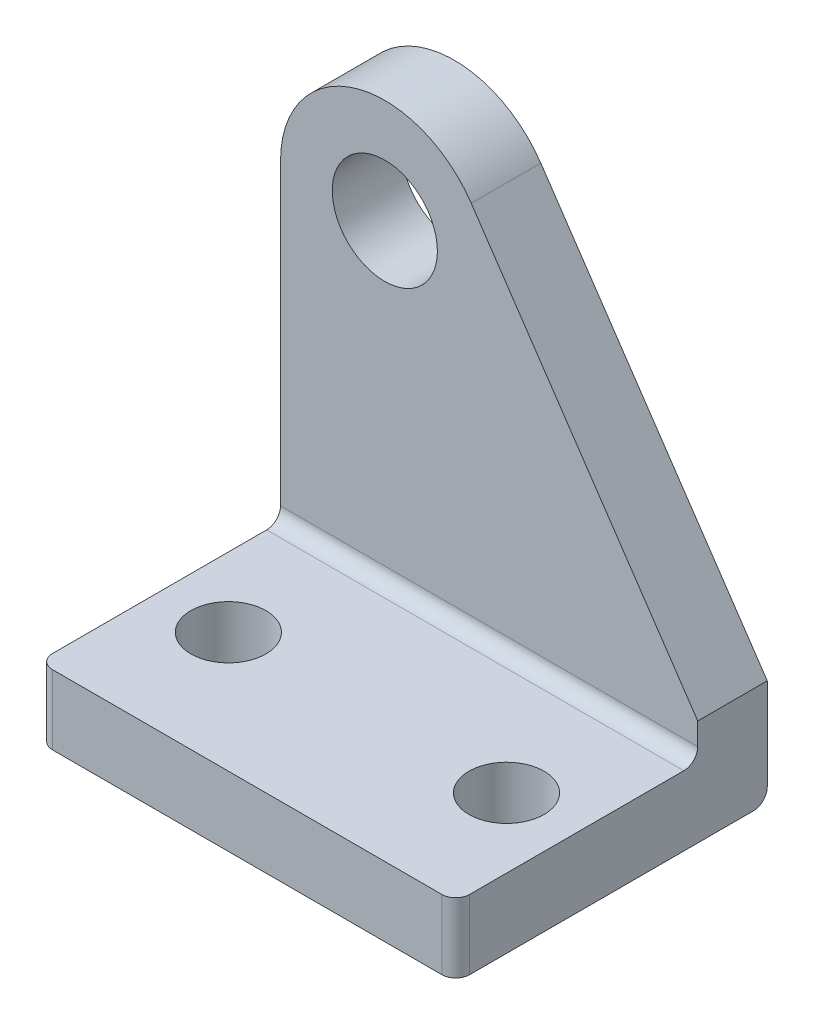
ISO-10303-21;
HEADER;
FILE_DESCRIPTION(('STEP AP214'),'2;1');
FILE_NAME('part.step','',(''),(''),'','','');
FILE_SCHEMA(('AUTOMOTIVE_DESIGN { 1 0 10303 214 1 1 1 1 }'));
ENDSEC;
DATA;
#1=APPLICATION_CONTEXT('core data for automotive mechanical design processes');
#2=APPLICATION_PROTOCOL_DEFINITION('international standard','automotive_design',2000,#1);
#3=PRODUCT_CONTEXT('',#1,'mechanical');
#4=PRODUCT('Part','Part','',(#3));
#5=PRODUCT_RELATED_PRODUCT_CATEGORY('part','',(#4));
#6=PRODUCT_DEFINITION_FORMATION('','',#4);
#7=PRODUCT_DEFINITION_CONTEXT('part definition',#1,'design');
#8=PRODUCT_DEFINITION('design','',#6,#7);
#9=PRODUCT_DEFINITION_SHAPE('','',#8);
#10=(LENGTH_UNIT() NAMED_UNIT(*) SI_UNIT(.MILLI.,.METRE.));
#11=(NAMED_UNIT(*) PLANE_ANGLE_UNIT() SI_UNIT($,.RADIAN.));
#12=(NAMED_UNIT(*) SI_UNIT($,.STERADIAN.) SOLID_ANGLE_UNIT());
#13=UNCERTAINTY_MEASURE_WITH_UNIT(LENGTH_MEASURE(1.E-05),#10,'distance_accuracy_value','');
#14=(GEOMETRIC_REPRESENTATION_CONTEXT(3) GLOBAL_UNCERTAINTY_ASSIGNED_CONTEXT((#13)) GLOBAL_UNIT_ASSIGNED_CONTEXT((#10,
#11,#12)) REPRESENTATION_CONTEXT('',''));
#15=CARTESIAN_POINT('',(0.,0.,0.));
#16=DIRECTION('',(0.,0.,1.));
#17=DIRECTION('',(1.,0.,0.));
#18=AXIS2_PLACEMENT_3D('',#15,#16,#17);
#19=CARTESIAN_POINT('',(12.6999999999998,-15.875,3.2385));
#20=DIRECTION('',(0.,1.,0.));
#21=DIRECTION('',(0.,0.,1.));
#22=AXIS2_PLACEMENT_3D('',#19,#20,#21);
#23=CYLINDRICAL_SURFACE('',#22,3.429);
#24=CARTESIAN_POINT('',(12.6999999999998,-22.225,3.2385));
#25=DIRECTION('',(0.,1.,0.));
#26=DIRECTION('',(0.,0.,1.));
#27=AXIS2_PLACEMENT_3D('',#24,#25,#26);
#28=CIRCLE('',#27,3.429);
#29=CARTESIAN_POINT('',(12.6999999999998,-22.225,6.6675));
#30=VERTEX_POINT('',#29);
#31=EDGE_CURVE('E169',#30,#30,#28,.F.);
#32=ORIENTED_EDGE('',*,*,#31,.T.);
#33=EDGE_LOOP('',(#32));
#34=FACE_BOUND('',#33,.T.);
#35=CARTESIAN_POINT('',(12.6999999999998,-15.875,3.2385));
#36=DIRECTION('',(0.,1.,0.));
#37=DIRECTION('',(0.,0.,1.));
#38=AXIS2_PLACEMENT_3D('',#35,#36,#37);
#39=CIRCLE('',#38,3.429);
#40=CARTESIAN_POINT('',(12.6999999999998,-15.875,6.6675));
#41=VERTEX_POINT('',#40);
#42=EDGE_CURVE('E19',#41,#41,#39,.T.);
#43=ORIENTED_EDGE('',*,*,#42,.T.);
#44=EDGE_LOOP('',(#43));
#45=FACE_BOUND('',#44,.T.);
#46=ADVANCED_FACE('F16',(#34,#45),#23,.F.);
#47=CARTESIAN_POINT('',(-12.7000000000002,-15.875,3.2385));
#48=DIRECTION('',(0.,1.,0.));
#49=DIRECTION('',(0.,0.,1.));
#50=AXIS2_PLACEMENT_3D('',#47,#48,#49);
#51=CYLINDRICAL_SURFACE('',#50,3.429);
#52=CARTESIAN_POINT('',(-12.7000000000002,-22.225,3.2385));
#53=DIRECTION('',(0.,1.,0.));
#54=DIRECTION('',(0.,0.,1.));
#55=AXIS2_PLACEMENT_3D('',#52,#53,#54);
#56=CIRCLE('',#55,3.429);
#57=CARTESIAN_POINT('',(-12.7000000000002,-22.225,6.6675));
#58=VERTEX_POINT('',#57);
#59=EDGE_CURVE('E166',#58,#58,#56,.F.);
#60=ORIENTED_EDGE('',*,*,#59,.T.);
#61=EDGE_LOOP('',(#60));
#62=FACE_BOUND('',#61,.T.);
#63=CARTESIAN_POINT('',(-12.7000000000002,-15.875,3.2385));
#64=DIRECTION('',(0.,1.,0.));
#65=DIRECTION('',(0.,0.,1.));
#66=AXIS2_PLACEMENT_3D('',#63,#64,#65);
#67=CIRCLE('',#66,3.429);
#68=CARTESIAN_POINT('',(-12.7000000000002,-15.875,6.6675));
#69=VERTEX_POINT('',#68);
#70=EDGE_CURVE('E172',#69,#69,#67,.T.);
#71=ORIENTED_EDGE('',*,*,#70,.T.);
#72=EDGE_LOOP('',(#71));
#73=FACE_BOUND('',#72,.T.);
#74=ADVANCED_FACE('F390',(#62,#73),#51,.F.);
#75=CARTESIAN_POINT('',(19.05,-15.875,14.224));
#76=DIRECTION('',(0.,0.,-1.));
#77=DIRECTION('',(-1.,0.,0.));
#78=AXIS2_PLACEMENT_3D('',#75,#76,#77);
#79=PLANE('',#78);
#80=DIRECTION('',(1.,0.,0.));
#81=VECTOR('',#80,1.);
#82=CARTESIAN_POINT('',(19.05,-22.225,14.224));
#83=LINE('',#82,#81);
#84=CARTESIAN_POINT('',(-17.7800000000001,-22.225,14.224));
#85=VERTEX_POINT('',#84);
#86=CARTESIAN_POINT('',(17.7799999999999,-22.225,14.224));
#87=VERTEX_POINT('',#86);
#88=EDGE_CURVE('E161',#85,#87,#83,.T.);
#89=ORIENTED_EDGE('',*,*,#88,.T.);
#90=DIRECTION('',(0.,1.,0.));
#91=VECTOR('',#90,1.);
#92=CARTESIAN_POINT('',(17.7799999999999,-15.875,14.224));
#93=LINE('',#92,#91);
#94=CARTESIAN_POINT('',(17.7799999999999,-15.875,14.224));
#95=VERTEX_POINT('',#94);
#96=EDGE_CURVE('E133',#95,#87,#93,.F.);
#97=ORIENTED_EDGE('',*,*,#96,.F.);
#98=DIRECTION('',(1.,0.,0.));
#99=VECTOR('',#98,1.);
#100=CARTESIAN_POINT('',(19.05,-15.875,14.224));
#101=LINE('',#100,#99);
#102=CARTESIAN_POINT('',(-17.7800000000001,-15.875,14.224));
#103=VERTEX_POINT('',#102);
#104=EDGE_CURVE('E101',#95,#103,#101,.F.);
#105=ORIENTED_EDGE('',*,*,#104,.T.);
#106=DIRECTION('',(0.,1.,0.));
#107=VECTOR('',#106,1.);
#108=CARTESIAN_POINT('',(-17.7800000000001,-15.875,14.224));
#109=LINE('',#108,#107);
#110=EDGE_CURVE('E130',#85,#103,#109,.T.);
#111=ORIENTED_EDGE('',*,*,#110,.F.);
#112=EDGE_LOOP('',(#89,#97,#105,#111));
#113=FACE_BOUND('',#112,.T.);
#114=ADVANCED_FACE('F211',(#113),#79,.F.);
#115=CARTESIAN_POINT('',(17.7799999999999,-15.875,12.954));
#116=DIRECTION('',(0.,1.,0.));
#117=DIRECTION('',(0.,0.,1.));
#118=AXIS2_PLACEMENT_3D('',#115,#116,#117);
#119=CYLINDRICAL_SURFACE('',#118,1.26999999999998);
#120=CARTESIAN_POINT('',(17.7799999999999,-15.875,12.954));
#121=DIRECTION('',(0.,1.,0.));
#122=DIRECTION('',(0.,0.,1.));
#123=AXIS2_PLACEMENT_3D('',#120,#121,#122);
#124=CIRCLE('',#123,1.26999999999998);
#125=CARTESIAN_POINT('',(19.05,-15.875,12.954));
#126=VERTEX_POINT('',#125);
#127=EDGE_CURVE('E94',#126,#95,#124,.F.);
#128=ORIENTED_EDGE('',*,*,#127,.T.);
#129=ORIENTED_EDGE('',*,*,#96,.T.);
#130=CARTESIAN_POINT('',(17.7799999999999,-22.225,12.954));
#131=DIRECTION('',(0.,1.,0.));
#132=DIRECTION('',(0.,0.,1.));
#133=AXIS2_PLACEMENT_3D('',#130,#131,#132);
#134=CIRCLE('',#133,1.26999999999998);
#135=CARTESIAN_POINT('',(19.05,-22.225,12.954));
#136=VERTEX_POINT('',#135);
#137=EDGE_CURVE('E117',#87,#136,#134,.T.);
#138=ORIENTED_EDGE('',*,*,#137,.T.);
#139=DIRECTION('',(0.,1.,0.));
#140=VECTOR('',#139,1.);
#141=CARTESIAN_POINT('',(19.05,-20.955,12.954));
#142=LINE('',#141,#140);
#143=EDGE_CURVE('E108',#126,#136,#142,.F.);
#144=ORIENTED_EDGE('',*,*,#143,.F.);
#145=EDGE_LOOP('',(#128,#129,#138,#144));
#146=FACE_BOUND('',#145,.T.);
#147=ADVANCED_FACE('F115',(#146),#119,.T.);
#148=CARTESIAN_POINT('',(19.05,22.225,-7.874));
#149=DIRECTION('',(0.,0.,-1.));
#150=DIRECTION('',(-1.,0.,0.));
#151=AXIS2_PLACEMENT_3D('',#148,#149,#150);
#152=PLANE('',#151);
#153=CARTESIAN_POINT('',(-9.525,12.7,-7.874));
#154=DIRECTION('',(0.,0.,1.));
#155=DIRECTION('',(1.,0.,0.));
#156=AXIS2_PLACEMENT_3D('',#153,#154,#155);
#157=CIRCLE('',#156,9.525);
#158=CARTESIAN_POINT('',(-19.05,12.7,-7.874));
#159=VERTEX_POINT('',#158);
#160=CARTESIAN_POINT('',(-1.63307314916778,18.033208750941,-7.874));
#161=VERTEX_POINT('',#160);
#162=EDGE_CURVE('E153',#159,#161,#157,.F.);
#163=ORIENTED_EDGE('',*,*,#162,.F.);
#164=DIRECTION('',(0.,1.,0.));
#165=VECTOR('',#164,1.);
#166=CARTESIAN_POINT('',(-19.05,-20.955,-7.874));
#167=LINE('',#166,#165);
#168=CARTESIAN_POINT('',(-19.05,-14.605,-7.874));
#169=VERTEX_POINT('',#168);
#170=EDGE_CURVE('E148',#159,#169,#167,.F.);
#171=ORIENTED_EDGE('',*,*,#170,.T.);
#172=DIRECTION('',(1.,0.,0.));
#173=VECTOR('',#172,1.);
#174=CARTESIAN_POINT('',(19.05,-14.605,-7.874));
#175=LINE('',#174,#173);
#176=CARTESIAN_POINT('',(19.05,-14.605,-7.874));
#177=VERTEX_POINT('',#176);
#178=EDGE_CURVE('E135',#169,#177,#175,.T.);
#179=ORIENTED_EDGE('',*,*,#178,.T.);
#180=DIRECTION('',(0.,1.,0.));
#181=VECTOR('',#180,1.);
#182=CARTESIAN_POINT('',(19.05,-20.955,-7.874));
#183=LINE('',#182,#181);
#184=CARTESIAN_POINT('',(19.05,-12.573,-7.87400000000001));
#185=VERTEX_POINT('',#184);
#186=EDGE_CURVE('E157',#185,#177,#183,.F.);
#187=ORIENTED_EDGE('',*,*,#186,.F.);
#188=DIRECTION('',(0.559916929232647,-0.828548750743541,0.));
#189=VECTOR('',#188,1.);
#190=CARTESIAN_POINT('',(19.05,-12.573,-7.87400000000001));
#191=LINE('',#190,#189);
#192=EDGE_CURVE('E113',#185,#161,#191,.F.);
#193=ORIENTED_EDGE('',*,*,#192,.T.);
#194=EDGE_LOOP('',(#163,#171,#179,#187,#193));
#195=FACE_BOUND('',#194,.T.);
#196=CARTESIAN_POINT('',(-9.525,12.7,-7.874));
#197=DIRECTION('',(0.,0.,1.));
#198=DIRECTION('',(1.,0.,0.));
#199=AXIS2_PLACEMENT_3D('',#196,#197,#198);
#200=CIRCLE('',#199,4.8006);
#201=CARTESIAN_POINT('',(-4.7244,12.7,-7.874));
#202=VERTEX_POINT('',#201);
#203=EDGE_CURVE('E124',#202,#202,#200,.F.);
#204=ORIENTED_EDGE('',*,*,#203,.T.);
#205=EDGE_LOOP('',(#204));
#206=FACE_BOUND('',#205,.T.);
#207=ADVANCED_FACE('F246',(#195,#206),#152,.F.);
#208=CARTESIAN_POINT('',(19.05,-14.605,-6.604));
#209=DIRECTION('',(1.,0.,0.));
#210=DIRECTION('',(0.,0.,-1.));
#211=AXIS2_PLACEMENT_3D('',#208,#209,#210);
#212=CYLINDRICAL_SURFACE('',#211,1.27);
#213=DIRECTION('',(1.,0.,0.));
#214=VECTOR('',#213,1.);
#215=CARTESIAN_POINT('',(19.05,-15.875,-6.604));
#216=LINE('',#215,#214);
#217=CARTESIAN_POINT('',(-19.05,-15.875,-6.604));
#218=VERTEX_POINT('',#217);
#219=CARTESIAN_POINT('',(19.05,-15.875,-6.604));
#220=VERTEX_POINT('',#219);
#221=EDGE_CURVE('E104',#218,#220,#216,.T.);
#222=ORIENTED_EDGE('',*,*,#221,.T.);
#223=CARTESIAN_POINT('',(19.05,-14.605,-6.604));
#224=DIRECTION('',(1.,0.,0.));
#225=DIRECTION('',(0.,0.,-1.));
#226=AXIS2_PLACEMENT_3D('',#223,#224,#225);
#227=CIRCLE('',#226,1.27);
#228=EDGE_CURVE('E111',#177,#220,#227,.F.);
#229=ORIENTED_EDGE('',*,*,#228,.F.);
#230=ORIENTED_EDGE('',*,*,#178,.F.);
#231=CARTESIAN_POINT('',(-19.05,-14.605,-6.604));
#232=DIRECTION('',(1.,0.,0.));
#233=DIRECTION('',(0.,0.,-1.));
#234=AXIS2_PLACEMENT_3D('',#231,#232,#233);
#235=CIRCLE('',#234,1.27);
#236=EDGE_CURVE('E144',#169,#218,#235,.F.);
#237=ORIENTED_EDGE('',*,*,#236,.T.);
#238=EDGE_LOOP('',(#222,#229,#230,#237));
#239=FACE_BOUND('',#238,.T.);
#240=ADVANCED_FACE('F249',(#239),#212,.F.);
#241=CARTESIAN_POINT('',(19.05,-15.875,-6.604));
#242=DIRECTION('',(0.,-1.,0.));
#243=DIRECTION('',(0.,0.,-1.));
#244=AXIS2_PLACEMENT_3D('',#241,#242,#243);
#245=PLANE('',#244);
#246=CARTESIAN_POINT('',(-17.7800000000001,-15.875,12.954));
#247=DIRECTION('',(0.,1.,0.));
#248=DIRECTION('',(0.,0.,1.));
#249=AXIS2_PLACEMENT_3D('',#246,#247,#248);
#250=CIRCLE('',#249,1.27);
#251=CARTESIAN_POINT('',(-19.05,-15.875,12.954));
#252=VERTEX_POINT('',#251);
#253=EDGE_CURVE('E132',#103,#252,#250,.F.);
#254=ORIENTED_EDGE('',*,*,#253,.F.);
#255=ORIENTED_EDGE('',*,*,#104,.F.);
#256=ORIENTED_EDGE('',*,*,#127,.F.);
#257=DIRECTION('',(0.,0.,-1.));
#258=VECTOR('',#257,1.);
#259=CARTESIAN_POINT('',(19.05,-15.875,-12.954));
#260=LINE('',#259,#258);
#261=EDGE_CURVE('E99',#220,#126,#260,.F.);
#262=ORIENTED_EDGE('',*,*,#261,.F.);
#263=ORIENTED_EDGE('',*,*,#221,.F.);
#264=DIRECTION('',(0.,0.,-1.));
#265=VECTOR('',#264,1.);
#266=CARTESIAN_POINT('',(-19.05,-15.875,-12.954));
#267=LINE('',#266,#265);
#268=EDGE_CURVE('E147',#218,#252,#267,.F.);
#269=ORIENTED_EDGE('',*,*,#268,.T.);
#270=EDGE_LOOP('',(#254,#255,#256,#262,#263,#269));
#271=FACE_BOUND('',#270,.T.);
#272=ORIENTED_EDGE('',*,*,#70,.F.);
#273=EDGE_LOOP('',(#272));
#274=FACE_BOUND('',#273,.T.);
#275=ORIENTED_EDGE('',*,*,#42,.F.);
#276=EDGE_LOOP('',(#275));
#277=FACE_BOUND('',#276,.T.);
#278=ADVANCED_FACE('F97',(#271,#274,#277),#245,.F.);
#279=CARTESIAN_POINT('',(-17.7800000000001,-15.875,12.954));
#280=DIRECTION('',(0.,1.,0.));
#281=DIRECTION('',(0.,0.,1.));
#282=AXIS2_PLACEMENT_3D('',#279,#280,#281);
#283=CYLINDRICAL_SURFACE('',#282,1.27);
#284=ORIENTED_EDGE('',*,*,#253,.T.);
#285=DIRECTION('',(0.,1.,0.));
#286=VECTOR('',#285,1.);
#287=CARTESIAN_POINT('',(-19.05,-20.955,12.954));
#288=LINE('',#287,#286);
#289=CARTESIAN_POINT('',(-19.05,-22.225,12.954));
#290=VERTEX_POINT('',#289);
#291=EDGE_CURVE('E207',#252,#290,#288,.F.);
#292=ORIENTED_EDGE('',*,*,#291,.T.);
#293=CARTESIAN_POINT('',(-17.7800000000001,-22.225,12.954));
#294=DIRECTION('',(0.,1.,0.));
#295=DIRECTION('',(0.,0.,1.));
#296=AXIS2_PLACEMENT_3D('',#293,#294,#295);
#297=CIRCLE('',#296,1.27);
#298=EDGE_CURVE('E162',#290,#85,#297,.T.);
#299=ORIENTED_EDGE('',*,*,#298,.T.);
#300=ORIENTED_EDGE('',*,*,#110,.T.);
#301=EDGE_LOOP('',(#284,#292,#299,#300));
#302=FACE_BOUND('',#301,.T.);
#303=ADVANCED_FACE('F217',(#302),#283,.T.);
#304=CARTESIAN_POINT('',(19.05,-22.225,14.224));
#305=DIRECTION('',(0.,1.,0.));
#306=DIRECTION('',(0.,0.,1.));
#307=AXIS2_PLACEMENT_3D('',#304,#305,#306);
#308=PLANE('',#307);
#309=ORIENTED_EDGE('',*,*,#298,.F.);
#310=DIRECTION('',(0.,0.,-1.));
#311=VECTOR('',#310,1.);
#312=CARTESIAN_POINT('',(-19.05,-22.225,-12.954));
#313=LINE('',#312,#311);
#314=CARTESIAN_POINT('',(-19.05,-22.225,-12.954));
#315=VERTEX_POINT('',#314);
#316=EDGE_CURVE('E143',#290,#315,#313,.T.);
#317=ORIENTED_EDGE('',*,*,#316,.T.);
#318=DIRECTION('',(1.,0.,0.));
#319=VECTOR('',#318,1.);
#320=CARTESIAN_POINT('',(19.05,-22.225,-12.954));
#321=LINE('',#320,#319);
#322=CARTESIAN_POINT('',(19.05,-22.225,-12.954));
#323=VERTEX_POINT('',#322);
#324=EDGE_CURVE('E120',#323,#315,#321,.F.);
#325=ORIENTED_EDGE('',*,*,#324,.F.);
#326=DIRECTION('',(0.,0.,-1.));
#327=VECTOR('',#326,1.);
#328=CARTESIAN_POINT('',(19.05,-22.225,-12.954));
#329=LINE('',#328,#327);
#330=EDGE_CURVE('E119',#136,#323,#329,.T.);
#331=ORIENTED_EDGE('',*,*,#330,.F.);
#332=ORIENTED_EDGE('',*,*,#137,.F.);
#333=ORIENTED_EDGE('',*,*,#88,.F.);
#334=EDGE_LOOP('',(#309,#317,#325,#331,#332,#333));
#335=FACE_BOUND('',#334,.T.);
#336=ORIENTED_EDGE('',*,*,#59,.F.);
#337=EDGE_LOOP('',(#336));
#338=FACE_BOUND('',#337,.T.);
#339=ORIENTED_EDGE('',*,*,#31,.F.);
#340=EDGE_LOOP('',(#339));
#341=FACE_BOUND('',#340,.T.);
#342=ADVANCED_FACE('F255',(#335,#338,#341),#308,.F.);
#343=CARTESIAN_POINT('',(-9.525,12.7,-7.874));
#344=DIRECTION('',(0.,0.,1.));
#345=DIRECTION('',(1.,0.,0.));
#346=AXIS2_PLACEMENT_3D('',#343,#344,#345);
#347=CYLINDRICAL_SURFACE('',#346,4.8006);
#348=CARTESIAN_POINT('',(-9.525,12.7,-14.224));
#349=DIRECTION('',(0.,0.,1.));
#350=DIRECTION('',(1.,0.,0.));
#351=AXIS2_PLACEMENT_3D('',#348,#349,#350);
#352=CIRCLE('',#351,4.8006);
#353=CARTESIAN_POINT('',(-4.7244,12.7,-14.224));
#354=VERTEX_POINT('',#353);
#355=EDGE_CURVE('E139',#354,#354,#352,.F.);
#356=ORIENTED_EDGE('',*,*,#355,.T.);
#357=EDGE_LOOP('',(#356));
#358=FACE_BOUND('',#357,.T.);
#359=ORIENTED_EDGE('',*,*,#203,.F.);
#360=EDGE_LOOP('',(#359));
#361=FACE_BOUND('',#360,.T.);
#362=ADVANCED_FACE('F253',(#358,#361),#347,.F.);
#363=CARTESIAN_POINT('',(19.05,-20.955,-12.954));
#364=DIRECTION('',(1.,0.,0.));
#365=DIRECTION('',(0.,0.,-1.));
#366=AXIS2_PLACEMENT_3D('',#363,#364,#365);
#367=CYLINDRICAL_SURFACE('',#366,1.27);
#368=CARTESIAN_POINT('',(19.05,-20.955,-12.954));
#369=DIRECTION('',(1.,0.,0.));
#370=DIRECTION('',(0.,0.,-1.));
#371=AXIS2_PLACEMENT_3D('',#368,#369,#370);
#372=CIRCLE('',#371,1.27);
#373=CARTESIAN_POINT('',(19.05,-20.955,-14.224));
#374=VERTEX_POINT('',#373);
#375=EDGE_CURVE('E122',#323,#374,#372,.T.);
#376=ORIENTED_EDGE('',*,*,#375,.F.);
#377=ORIENTED_EDGE('',*,*,#324,.T.);
#378=CARTESIAN_POINT('',(-19.05,-20.955,-12.954));
#379=DIRECTION('',(1.,0.,0.));
#380=DIRECTION('',(0.,0.,-1.));
#381=AXIS2_PLACEMENT_3D('',#378,#379,#380);
#382=CIRCLE('',#381,1.27);
#383=CARTESIAN_POINT('',(-19.05,-20.955,-14.224));
#384=VERTEX_POINT('',#383);
#385=EDGE_CURVE('E149',#315,#384,#382,.T.);
#386=ORIENTED_EDGE('',*,*,#385,.T.);
#387=DIRECTION('',(1.,0.,0.));
#388=VECTOR('',#387,1.);
#389=CARTESIAN_POINT('',(19.05,-20.955,-14.224));
#390=LINE('',#389,#388);
#391=EDGE_CURVE('E142',#384,#374,#390,.T.);
#392=ORIENTED_EDGE('',*,*,#391,.T.);
#393=EDGE_LOOP('',(#376,#377,#386,#392));
#394=FACE_BOUND('',#393,.T.);
#395=ADVANCED_FACE('F235',(#394),#367,.T.);
#396=CARTESIAN_POINT('',(19.05,-20.955,-12.954));
#397=DIRECTION('',(1.,0.,0.));
#398=DIRECTION('',(0.,0.,-1.));
#399=AXIS2_PLACEMENT_3D('',#396,#397,#398);
#400=PLANE('',#399);
#401=ORIENTED_EDGE('',*,*,#228,.T.);
#402=ORIENTED_EDGE('',*,*,#261,.T.);
#403=ORIENTED_EDGE('',*,*,#143,.T.);
#404=ORIENTED_EDGE('',*,*,#330,.T.);
#405=ORIENTED_EDGE('',*,*,#375,.T.);
#406=DIRECTION('',(0.,1.,0.));
#407=VECTOR('',#406,1.);
#408=CARTESIAN_POINT('',(19.05,-20.955,-14.224));
#409=LINE('',#408,#407);
#410=CARTESIAN_POINT('',(19.05,-12.573,-14.224));
#411=VERTEX_POINT('',#410);
#412=EDGE_CURVE('E198',#374,#411,#409,.T.);
#413=ORIENTED_EDGE('',*,*,#412,.T.);
#414=DIRECTION('',(0.,0.,1.));
#415=VECTOR('',#414,1.);
#416=CARTESIAN_POINT('',(19.05,-12.573,14.224));
#417=LINE('',#416,#415);
#418=EDGE_CURVE('E155',#411,#185,#417,.T.);
#419=ORIENTED_EDGE('',*,*,#418,.T.);
#420=ORIENTED_EDGE('',*,*,#186,.T.);
#421=EDGE_LOOP('',(#401,#402,#403,#404,#405,#413,#419,#420));
#422=FACE_BOUND('',#421,.T.);
#423=ADVANCED_FACE('F107',(#422),#400,.T.);
#424=CARTESIAN_POINT('',(19.05,-12.573,14.224));
#425=DIRECTION('',(-0.828548750743541,-0.559916929232647,0.));
#426=DIRECTION('',(0.559916929232647,-0.828548750743541,0.));
#427=AXIS2_PLACEMENT_3D('',#424,#425,#426);
#428=PLANE('',#427);
#429=DIRECTION('',(-0.559916929232649,0.82854875074354,0.));
#430=VECTOR('',#429,1.);
#431=CARTESIAN_POINT('',(19.05,-12.573,-14.224));
#432=LINE('',#431,#430);
#433=CARTESIAN_POINT('',(-1.63307314916782,18.033208750941,-14.224));
#434=VERTEX_POINT('',#433);
#435=EDGE_CURVE('E138',#411,#434,#432,.T.);
#436=ORIENTED_EDGE('',*,*,#435,.T.);
#437=DIRECTION('',(0.,0.,1.));
#438=VECTOR('',#437,1.);
#439=CARTESIAN_POINT('',(-1.6330731491678,18.033208750941,14.224));
#440=LINE('',#439,#438);
#441=EDGE_CURVE('E152',#161,#434,#440,.F.);
#442=ORIENTED_EDGE('',*,*,#441,.F.);
#443=ORIENTED_EDGE('',*,*,#192,.F.);
#444=ORIENTED_EDGE('',*,*,#418,.F.);
#445=EDGE_LOOP('',(#436,#442,#443,#444));
#446=FACE_BOUND('',#445,.T.);
#447=ADVANCED_FACE('F245',(#446),#428,.F.);
#448=CARTESIAN_POINT('',(-9.525,12.7,14.224));
#449=DIRECTION('',(0.,0.,1.));
#450=DIRECTION('',(1.,0.,0.));
#451=AXIS2_PLACEMENT_3D('',#448,#449,#450);
#452=CYLINDRICAL_SURFACE('',#451,9.525);
#453=ORIENTED_EDGE('',*,*,#162,.T.);
#454=ORIENTED_EDGE('',*,*,#441,.T.);
#455=CARTESIAN_POINT('',(-9.525,12.7,-14.224));
#456=DIRECTION('',(0.,0.,1.));
#457=DIRECTION('',(1.,0.,0.));
#458=AXIS2_PLACEMENT_3D('',#455,#456,#457);
#459=CIRCLE('',#458,9.525);
#460=CARTESIAN_POINT('',(-19.05,12.7,-14.224));
#461=VERTEX_POINT('',#460);
#462=EDGE_CURVE('E25',#434,#461,#459,.T.);
#463=ORIENTED_EDGE('',*,*,#462,.T.);
#464=DIRECTION('',(0.,0.,-1.));
#465=VECTOR('',#464,1.);
#466=CARTESIAN_POINT('',(-19.05,12.7,-12.954));
#467=LINE('',#466,#465);
#468=EDGE_CURVE('E33',#461,#159,#467,.F.);
#469=ORIENTED_EDGE('',*,*,#468,.T.);
#470=EDGE_LOOP('',(#453,#454,#463,#469));
#471=FACE_BOUND('',#470,.T.);
#472=ADVANCED_FACE('F270',(#471),#452,.T.);
#473=CARTESIAN_POINT('',(-19.05,-20.955,-12.954));
#474=DIRECTION('',(1.,0.,0.));
#475=DIRECTION('',(0.,0.,-1.));
#476=AXIS2_PLACEMENT_3D('',#473,#474,#475);
#477=PLANE('',#476);
#478=ORIENTED_EDGE('',*,*,#291,.F.);
#479=ORIENTED_EDGE('',*,*,#268,.F.);
#480=ORIENTED_EDGE('',*,*,#236,.F.);
#481=ORIENTED_EDGE('',*,*,#170,.F.);
#482=ORIENTED_EDGE('',*,*,#468,.F.);
#483=DIRECTION('',(0.,1.,0.));
#484=VECTOR('',#483,1.);
#485=CARTESIAN_POINT('',(-19.05,-20.955,-14.224));
#486=LINE('',#485,#484);
#487=EDGE_CURVE('E10',#461,#384,#486,.F.);
#488=ORIENTED_EDGE('',*,*,#487,.T.);
#489=ORIENTED_EDGE('',*,*,#385,.F.);
#490=ORIENTED_EDGE('',*,*,#316,.F.);
#491=EDGE_LOOP('',(#478,#479,#480,#481,#482,#488,#489,#490));
#492=FACE_BOUND('',#491,.T.);
#493=ADVANCED_FACE('F219',(#492),#477,.F.);
#494=CARTESIAN_POINT('',(19.05,-20.955,-14.224));
#495=DIRECTION('',(0.,0.,1.));
#496=DIRECTION('',(1.,0.,0.));
#497=AXIS2_PLACEMENT_3D('',#494,#495,#496);
#498=PLANE('',#497);
#499=ORIENTED_EDGE('',*,*,#462,.F.);
#500=ORIENTED_EDGE('',*,*,#435,.F.);
#501=ORIENTED_EDGE('',*,*,#412,.F.);
#502=ORIENTED_EDGE('',*,*,#391,.F.);
#503=ORIENTED_EDGE('',*,*,#487,.F.);
#504=EDGE_LOOP('',(#499,#500,#501,#502,#503));
#505=FACE_BOUND('',#504,.T.);
#506=ORIENTED_EDGE('',*,*,#355,.F.);
#507=EDGE_LOOP('',(#506));
#508=FACE_BOUND('',#507,.T.);
#509=ADVANCED_FACE('F239',(#505,#508),#498,.F.);
#510=CLOSED_SHELL('',(#46,#74,#114,#147,#207,#240,#278,#303,#342,#362,#395,#423,#447,#472,#493,#509));
#511=MANIFOLD_SOLID_BREP('B1',#510);
#512=ADVANCED_BREP_SHAPE_REPRESENTATION('',(#18,#511),#14);
#513=SHAPE_DEFINITION_REPRESENTATION(#9,#512);
ENDSEC;
END-ISO-10303-21;
